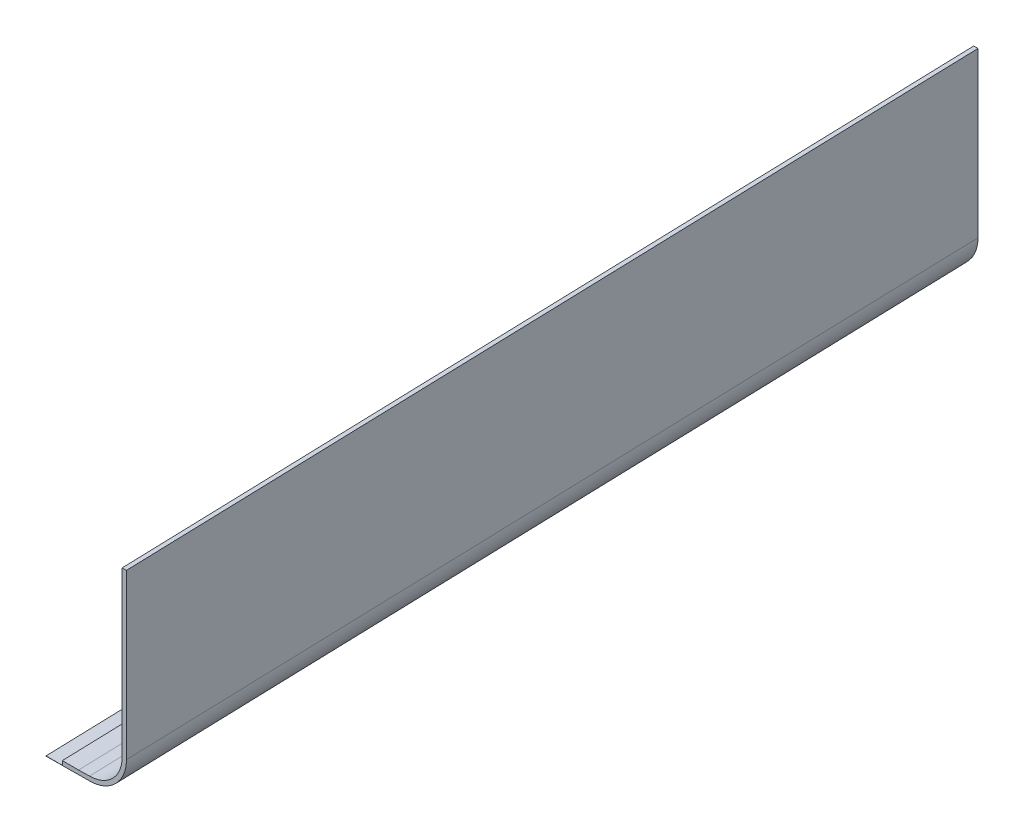
ISO-10303-21;
HEADER;
FILE_DESCRIPTION(('STEP AP214'),'2;1');
FILE_NAME('part.step','',(''),(''),'','','');
FILE_SCHEMA(('AUTOMOTIVE_DESIGN { 1 0 10303 214 1 1 1 1 }'));
ENDSEC;
DATA;
#1=APPLICATION_CONTEXT('core data for automotive mechanical design processes');
#2=APPLICATION_PROTOCOL_DEFINITION('international standard','automotive_design',2000,#1);
#3=PRODUCT_CONTEXT('',#1,'mechanical');
#4=PRODUCT('Part','Part','',(#3));
#5=PRODUCT_RELATED_PRODUCT_CATEGORY('part','',(#4));
#6=PRODUCT_DEFINITION_FORMATION('','',#4);
#7=PRODUCT_DEFINITION_CONTEXT('part definition',#1,'design');
#8=PRODUCT_DEFINITION('design','',#6,#7);
#9=PRODUCT_DEFINITION_SHAPE('','',#8);
#10=(LENGTH_UNIT() NAMED_UNIT(*) SI_UNIT(.MILLI.,.METRE.));
#11=(NAMED_UNIT(*) PLANE_ANGLE_UNIT() SI_UNIT($,.RADIAN.));
#12=(NAMED_UNIT(*) SI_UNIT($,.STERADIAN.) SOLID_ANGLE_UNIT());
#13=UNCERTAINTY_MEASURE_WITH_UNIT(LENGTH_MEASURE(1.E-05),#10,'distance_accuracy_value','');
#14=(GEOMETRIC_REPRESENTATION_CONTEXT(3) GLOBAL_UNCERTAINTY_ASSIGNED_CONTEXT((#13)) GLOBAL_UNIT_ASSIGNED_CONTEXT((#10,
#11,#12)) REPRESENTATION_CONTEXT('',''));
#15=CARTESIAN_POINT('',(0.,0.,0.));
#16=DIRECTION('',(0.,0.,1.));
#17=DIRECTION('',(1.,0.,0.));
#18=AXIS2_PLACEMENT_3D('',#15,#16,#17);
#19=CARTESIAN_POINT('',(-608.850787596417,19.0838018169764,1946.21768543067));
#20=DIRECTION('',(0.,0.,1.));
#21=DIRECTION('',(-1.,0.,0.));
#22=AXIS2_PLACEMENT_3D('',#19,#20,#21);
#23=PLANE('',#22);
#24=DIRECTION('',(-1.,0.,0.));
#25=VECTOR('',#24,1.);
#26=CARTESIAN_POINT('',(434.306263496742,9.50000000004892,1946.21768543067));
#27=LINE('',#26,#25);
#28=CARTESIAN_POINT('',(419.156982691729,9.50000000000034,1946.21768543067));
#29=VERTEX_POINT('',#28);
#30=CARTESIAN_POINT('',(381.05698269362,9.50000000006092,1946.21768543067));
#31=VERTEX_POINT('',#30);
#32=EDGE_CURVE('E51',#29,#31,#27,.T.);
#33=ORIENTED_EDGE('',*,*,#32,.T.);
#34=DIRECTION('',(0.,-1.,0.));
#35=VECTOR('',#34,1.);
#36=CARTESIAN_POINT('',(381.05698269362,9.50000000006085,1946.21768543067));
#37=LINE('',#36,#35);
#38=CARTESIAN_POINT('',(381.05698269362,4.87625381574441E-11,1946.21768543067));
#39=VERTEX_POINT('',#38);
#40=EDGE_CURVE('E133',#31,#39,#37,.T.);
#41=ORIENTED_EDGE('',*,*,#40,.T.);
#42=DIRECTION('',(-1.,0.,0.));
#43=VECTOR('',#42,1.);
#44=CARTESIAN_POINT('',(396.240241590001,4.87732762507734E-11,1946.21768543067));
#45=LINE('',#44,#43);
#46=CARTESIAN_POINT('',(342.939982275244,4.87355805779996E-11,1946.21768543067));
#47=VERTEX_POINT('',#46);
#48=EDGE_CURVE('E131',#39,#47,#45,.T.);
#49=ORIENTED_EDGE('',*,*,#48,.T.);
#50=DIRECTION('',(0.,-1.,0.));
#51=VECTOR('',#50,1.);
#52=CARTESIAN_POINT('',(342.939982275244,-0.55622483418302,1946.21768543067));
#53=LINE('',#52,#51);
#54=CARTESIAN_POINT('',(342.939982275244,-0.556224834243613,1946.21768543067));
#55=VERTEX_POINT('',#54);
#56=EDGE_CURVE('E184',#47,#55,#53,.T.);
#57=ORIENTED_EDGE('',*,*,#56,.T.);
#58=DIRECTION('',(0.999975311121071,0.00702688752706654,0.));
#59=VECTOR('',#58,1.);
#60=CARTESIAN_POINT('',(459.989454906777,0.266288952032419,1946.21768543067));
#61=LINE('',#60,#59);
#62=CARTESIAN_POINT('',(444.863846729292,0.160000380445076,1946.21768543067));
#63=VERTEX_POINT('',#62);
#64=EDGE_CURVE('E187',#55,#63,#61,.T.);
#65=ORIENTED_EDGE('',*,*,#64,.T.);
#66=CARTESIAN_POINT('',(444.863846727584,0.160000380433081,1946.21768543067));
#67=CARTESIAN_POINT('',(446.075132009914,0.16012658548986,1946.21768543067));
#68=CARTESIAN_POINT('',(447.286402545048,0.185942096113205,1946.21768543067));
#69=CARTESIAN_POINT('',(449.706818586305,0.288619720504979,1946.21768543067));
#70=CARTESIAN_POINT('',(450.915964023309,0.365483464888938,1946.21768543067));
#71=CARTESIAN_POINT('',(453.329989040791,0.56992823933107,1946.21768543067));
#72=CARTESIAN_POINT('',(454.534868506007,0.697510629370093,1946.21768543067));
#73=CARTESIAN_POINT('',(456.938224946225,1.00313623517374,1946.21768543067));
#74=CARTESIAN_POINT('',(458.136701852302,1.18117999307029,1946.21768543067));
#75=CARTESIAN_POINT('',(460.524156212143,1.58740577515196,1946.21768543067));
#76=CARTESIAN_POINT('',(461.713140427793,1.81554804394174,1946.21768543067));
#77=CARTESIAN_POINT('',(464.080390498519,2.32178732574375,1946.21768543067));
#78=CARTESIAN_POINT('',(465.258656644489,2.59988297872575,1946.21768543067));
#79=CARTESIAN_POINT('',(467.602400003739,3.20545805432234,1946.21768543067));
#80=CARTESIAN_POINT('',(468.767877588454,3.53293603857233,1946.21768543067));
#81=CARTESIAN_POINT('',(471.083926500928,4.23672634338672,1946.21768543067));
#82=CARTESIAN_POINT('',(472.234498275918,4.6130371950266,1946.21768543067));
#83=CARTESIAN_POINT('',(474.900240682015,5.54773573399297,1946.21768543067));
#84=CARTESIAN_POINT('',(476.408851896602,6.12496039562342,1946.21768543067));
#85=CARTESIAN_POINT('',(479.390936105928,7.36396436911601,1946.21768543067));
#86=CARTESIAN_POINT('',(480.86440810202,8.02574608067341,1946.21768543067));
#87=CARTESIAN_POINT('',(483.771896304211,9.4310315732472,1946.21768543067));
#88=CARTESIAN_POINT('',(485.205911456072,10.1745375351862,1946.21768543067));
#89=CARTESIAN_POINT('',(488.029881223033,11.7403046123265,1946.21768543067));
#90=CARTESIAN_POINT('',(489.419845030492,12.5625491509059,1946.21768543067));
#91=CARTESIAN_POINT('',(492.151792604209,14.2831614117084,1946.21768543067));
#92=CARTESIAN_POINT('',(493.493776854729,15.1815283653138,1946.21768543067));
#93=CARTESIAN_POINT('',(496.125610793553,17.0517182422845,1946.21768543067));
#94=CARTESIAN_POINT('',(497.415460680973,18.0235408850616,1946.21768543067));
#95=CARTESIAN_POINT('',(499.62590899119,19.7881554942323,1946.21768543067));
#96=CARTESIAN_POINT('',(500.558793361587,20.565623716279,1946.21768543067));
#97=CARTESIAN_POINT('',(502.390899150654,22.1594712899273,1946.21768543067));
#98=CARTESIAN_POINT('',(503.290118658197,22.9758528446442,1946.21768543067));
#99=CARTESIAN_POINT('',(504.612139734102,24.2285581215197,1946.21768543067));
#100=CARTESIAN_POINT('',(505.048348507215,24.6508185828612,1946.21768543067));
#101=CARTESIAN_POINT('',(505.91161331581,25.5045937795863,1946.21768543067));
#102=CARTESIAN_POINT('',(506.338669374485,25.9361084915141,1946.21768543067));
#103=CARTESIAN_POINT('',(507.605821365279,27.2441787030871,1946.21768543067));
#104=CARTESIAN_POINT('',(508.431965574148,28.134321366299,1946.21768543067));
#105=CARTESIAN_POINT('',(510.045872379531,29.9490048860587,1946.21768543067));
#106=CARTESIAN_POINT('',(510.833628173081,30.8735517886896,1946.21768543067));
#107=CARTESIAN_POINT('',(512.369397245156,32.7549975247759,1946.21768543067));
#108=CARTESIAN_POINT('',(513.117409617706,33.7118970949167,1946.21768543067));
#109=CARTESIAN_POINT('',(515.300184586929,36.6285965589517,1946.21768543067));
#110=CARTESIAN_POINT('',(516.673985658656,38.6347355647285,1946.21768543067));
#111=CARTESIAN_POINT('',(518.816316133548,42.0628983887761,1946.21768543067));
#112=CARTESIAN_POINT('',(519.633274084055,43.4550700178213,1946.21768543067));
#113=CARTESIAN_POINT('',(521.188256177966,46.2829374148307,1946.21768543067));
#114=CARTESIAN_POINT('',(521.926282726784,47.7186318547354,1946.21768543067));
#115=CARTESIAN_POINT('',(523.320540131027,50.629226047409,1946.21768543067));
#116=CARTESIAN_POINT('',(523.976768720845,52.1041268847277,1946.21768543067));
#117=CARTESIAN_POINT('',(525.204308251733,55.0879387823803,1946.21768543067));
#118=CARTESIAN_POINT('',(525.775664906084,56.5968310263492,1946.21768543067));
#119=CARTESIAN_POINT('',(526.832513288696,59.6443143741614,1946.21768543067));
#120=CARTESIAN_POINT('',(527.318007287181,61.1829046915887,1946.21768543067));
#121=CARTESIAN_POINT('',(528.201751682637,64.2846020300852,1946.21768543067));
#122=CARTESIAN_POINT('',(528.600023433324,65.8477029498336,1946.21768543067));
#123=CARTESIAN_POINT('',(529.187223223895,68.4564629356411,1946.21768543067));
#124=CARTESIAN_POINT('',(529.401197176231,69.4965569678018,1946.21768543067));
#125=CARTESIAN_POINT('',(529.790504211599,71.5837632884045,1946.21768543067));
#126=CARTESIAN_POINT('',(529.965845056845,72.6308741233759,1946.21768543067));
#127=CARTESIAN_POINT('',(530.277836450322,74.730730186376,1946.21768543067));
#128=CARTESIAN_POINT('',(530.414490778553,75.7834748536832,1946.21768543067));
#129=CARTESIAN_POINT('',(530.64882373004,77.8918794467869,1946.21768543067));
#130=CARTESIAN_POINT('',(530.74655387791,78.9475336436468,1946.21768543067));
#131=CARTESIAN_POINT('',(530.90312416498,81.0618246306778,1946.21768543067));
#132=CARTESIAN_POINT('',(530.961960609294,82.1204616946288,1946.21768543067));
#133=CARTESIAN_POINT('',(531.040504224417,84.2393962703731,1946.21768543067));
#134=CARTESIAN_POINT('',(531.06020360615,85.2996940706731,1946.21768543067));
#135=CARTESIAN_POINT('',(531.060210458669,86.3600000000617,1946.21768543067));
#136=B_SPLINE_CURVE_WITH_KNOTS('',3,(#66,#67,#68,#69,#70,#71,#72,#73,#74,#75,#76,#77,#78,#79,
#80,#81,#82,#83,#84,#85,#86,#87,#88,#89,#90,#91,#92,#93,#94,#95,#96,#97,#98,#99,#100,#101,#102,
#103,#104,#105,#106,#107,#108,#109,#110,#111,#112,#113,#114,#115,#116,#117,#118,#119,#120,#121,
#122,#123,#124,#125,#126,#127,#128,#129,#130,#131,#132,#133,#134,#135),.UNSPECIFIED.,.F.,.F.,(4,
2,2,2,2,2,2,2,2,2,2,2,2,2,2,2,2,2,2,2,2,2,2,2,2,2,2,2,2,2,2,2,2,2,4),(0.,3.63356640503929,
7.2672488813773,10.9010287986441,14.5348477569217,18.1657934722738,21.7966403465219,
25.4273814851131,29.0580134339474,33.9011169086868,38.7443578593073,43.5877280897865,
48.4300808908611,53.2723848039148,58.1146702211352,61.7568304011651,65.3991970310311,
67.2204071561581,69.0416126657918,72.6837574812032,76.3265454057439,79.9694163342264,
87.2538044987339,92.0941721614174,96.9343922729995,101.774746417149,106.612483947252,
111.450093547545,116.286517478941,119.471486559318,122.655815126732,125.839832450861,
129.019620915153,132.199711414666,135.380434753818),.UNSPECIFIED.);
#137=CARTESIAN_POINT('',(531.060210458669,86.3600000000617,1946.21768543067));
#138=VERTEX_POINT('',#137);
#139=EDGE_CURVE('E190',#63,#138,#136,.T.);
#140=ORIENTED_EDGE('',*,*,#139,.T.);
#141=DIRECTION('',(0.,1.,0.));
#142=VECTOR('',#141,1.);
#143=CARTESIAN_POINT('',(531.060210458669,86.3600000000737,1946.21768543067));
#144=LINE('',#143,#142);
#145=CARTESIAN_POINT('',(531.060210458669,469.900000000012,1946.21768543067));
#146=VERTEX_POINT('',#145);
#147=EDGE_CURVE('E193',#138,#146,#144,.T.);
#148=ORIENTED_EDGE('',*,*,#147,.T.);
#149=DIRECTION('',(-1.,0.,0.));
#150=VECTOR('',#149,1.);
#151=CARTESIAN_POINT('',(536.114154517747,469.9,1946.21768543067));
#152=LINE('',#151,#150);
#153=CARTESIAN_POINT('',(521.055748406601,469.9,1946.21768543067));
#154=VERTEX_POINT('',#153);
#155=EDGE_CURVE('E196',#146,#154,#152,.T.);
#156=ORIENTED_EDGE('',*,*,#155,.T.);
#157=DIRECTION('',(0.,-1.,0.));
#158=VECTOR('',#157,1.);
#159=CARTESIAN_POINT('',(521.055748406601,86.3600000000737,1946.21768543067));
#160=LINE('',#159,#158);
#161=CARTESIAN_POINT('',(521.055748406601,86.3600000000131,1946.21768543067));
#162=VERTEX_POINT('',#161);
#163=EDGE_CURVE('E169',#154,#162,#160,.T.);
#164=ORIENTED_EDGE('',*,*,#163,.T.);
#165=CARTESIAN_POINT('',(521.055748406601,86.3600000000617,1946.21768543067));
#166=CARTESIAN_POINT('',(521.055762011991,85.3041743859422,1946.21768543067));
#167=CARTESIAN_POINT('',(521.033804668349,84.2483497469097,1946.21768543067));
#168=CARTESIAN_POINT('',(520.946045879157,82.1385269283388,1946.21768543067));
#169=CARTESIAN_POINT('',(520.880244553959,81.0845287437947,1946.21768543067));
#170=CARTESIAN_POINT('',(520.704899262101,78.980221513989,1946.21768543067));
#171=CARTESIAN_POINT('',(520.595357124246,77.9299123163426,1946.21768543067));
#172=CARTESIAN_POINT('',(520.332723814989,75.8347537311795,1946.21768543067));
#173=CARTESIAN_POINT('',(520.179632675189,74.7899043397012,1946.21768543067));
#174=CARTESIAN_POINT('',(519.830167712473,72.7074878920014,1946.21768543067));
#175=CARTESIAN_POINT('',(519.633794648781,71.6699207083693,1946.21768543067));
#176=CARTESIAN_POINT('',(519.198084009917,69.6037485318348,1946.21768543067));
#177=CARTESIAN_POINT('',(518.958742531508,68.5751443620375,1946.21768543067));
#178=CARTESIAN_POINT('',(518.43754719727,66.5288757692183,1946.21768543067));
#179=CARTESIAN_POINT('',(518.155697697832,65.5112102365976,1946.21768543067));
#180=CARTESIAN_POINT('',(517.549927696816,63.4883778286707,1946.21768543067));
#181=CARTESIAN_POINT('',(517.226003373693,62.4832120977868,1946.21768543067));
#182=CARTESIAN_POINT('',(516.536694084313,60.4872995351224,1946.21768543067));
#183=CARTESIAN_POINT('',(516.171312835228,59.4965514195818,1946.21768543067));
#184=CARTESIAN_POINT('',(515.399662567441,57.5310044401117,1946.21768543067));
#185=CARTESIAN_POINT('',(514.9933898351,56.5562070341396,1946.21768543067));
#186=CARTESIAN_POINT('',(514.140720182314,54.6244159190985,1946.21768543067));
#187=CARTESIAN_POINT('',(513.69432655444,53.6674207568317,1946.21768543067));
#188=CARTESIAN_POINT('',(512.76211901337,51.7727234904998,1946.21768543067));
#189=CARTESIAN_POINT('',(512.276301516891,50.8350231498959,1946.21768543067));
#190=CARTESIAN_POINT('',(511.266155255996,48.9806960684853,1946.21768543067));
#191=CARTESIAN_POINT('',(510.741830143782,48.0640673399701,1946.21768543067));
#192=CARTESIAN_POINT('',(509.655533883467,46.2533554666254,1946.21768543067));
#193=CARTESIAN_POINT('',(509.093559261496,45.3592744127448,1946.21768543067));
#194=CARTESIAN_POINT('',(507.35271383301,42.7134071620176,1946.21768543067));
#195=CARTESIAN_POINT('',(506.118652855966,40.9975039342189,1946.21768543067));
#196=CARTESIAN_POINT('',(503.512256394921,37.6741333975381,1946.21768543067));
#197=CARTESIAN_POINT('',(502.139920517038,36.0666663975624,1946.21768543067));
#198=CARTESIAN_POINT('',(499.985207312558,33.7453765906076,1946.21768543067));
#199=CARTESIAN_POINT('',(499.250833229163,32.9865058819205,1946.21768543067));
#200=CARTESIAN_POINT('',(497.7512111848,31.4999577461374,1946.21768543067));
#201=CARTESIAN_POINT('',(496.985966082508,30.7722774436018,1946.21768543067));
#202=CARTESIAN_POINT('',(495.425843649886,29.3492957187999,1946.21768543067));
#203=CARTESIAN_POINT('',(494.630963783755,28.6539970788866,1946.21768543067));
#204=CARTESIAN_POINT('',(493.013067150578,27.297091131196,1946.21768543067));
#205=CARTESIAN_POINT('',(492.190052950058,26.6354807638765,1946.21768543067));
#206=CARTESIAN_POINT('',(490.517156035563,25.3469628688933,1946.21768543067));
#207=CARTESIAN_POINT('',(489.667270492859,24.7200590139988,1946.21768543067));
#208=CARTESIAN_POINT('',(487.942259463241,23.5021668308412,1946.21768543067));
#209=CARTESIAN_POINT('',(487.067136277309,22.9111752435323,1946.21768543067));
#210=CARTESIAN_POINT('',(485.292991088897,21.7660043107471,1946.21768543067));
#211=CARTESIAN_POINT('',(484.393966484036,21.2118289969927,1946.21768543067));
#212=CARTESIAN_POINT('',(482.573746305612,20.1413673843701,1946.21768543067));
#213=CARTESIAN_POINT('',(481.652552754398,19.6250776466787,1946.21768543067));
#214=CARTESIAN_POINT('',(479.78947068903,18.6312040151805,1946.21768543067));
#215=CARTESIAN_POINT('',(478.847581363461,18.1536216424183,1946.21768543067));
#216=CARTESIAN_POINT('',(476.944856558375,17.2380519927266,1946.21768543067));
#217=CARTESIAN_POINT('',(475.984022806229,16.8000611259553,1946.21768543067));
#218=CARTESIAN_POINT('',(474.044989135933,15.9643838980697,1946.21768543067));
#219=CARTESIAN_POINT('',(473.066789290169,15.5666973690016,1946.21768543067));
#220=CARTESIAN_POINT('',(471.094730492017,14.8123211862943,1946.21768543067));
#221=CARTESIAN_POINT('',(470.100871831453,14.4556307696614,1946.21768543067));
#222=CARTESIAN_POINT('',(468.099040599589,13.7838046175111,1946.21768543067));
#223=CARTESIAN_POINT('',(467.091066036365,13.4686748134106,1946.21768543067));
#224=CARTESIAN_POINT('',(465.062850996571,12.8805597794046,1946.21768543067));
#225=CARTESIAN_POINT('',(464.042609641668,12.6075775869795,1946.21768543067));
#226=CARTESIAN_POINT('',(461.534112942367,11.9919745698792,1946.21768543067));
#227=CARTESIAN_POINT('',(460.040083847673,11.6726025832629,1946.21768543067));
#228=CARTESIAN_POINT('',(457.035403536861,11.1241769998362,1946.21768543067));
#229=CARTESIAN_POINT('',(455.524749873552,10.8951368880352,1946.21768543067));
#230=CARTESIAN_POINT('',(452.49031414566,10.5280044862022,1946.21768543067));
#231=CARTESIAN_POINT('',(450.966517546094,10.3900310251121,1946.21768543067));
#232=CARTESIAN_POINT('',(448.67696827238,10.2520297908036,1946.21768543067));
#233=CARTESIAN_POINT('',(447.913148514924,10.2175225391374,1946.21768543067));
#234=CARTESIAN_POINT('',(446.384818043396,10.1715078741109,1946.21768543067));
#235=CARTESIAN_POINT('',(445.620307330716,10.1600004145722,1946.21768543067));
#236=CARTESIAN_POINT('',(444.855748406601,10.1600000000617,1946.21768543067));
#237=B_SPLINE_CURVE_WITH_KNOTS('',3,(#165,#166,#167,#168,#169,#170,#171,#172,#173,#174,#175,
#176,#177,#178,#179,#180,#181,#182,#183,#184,#185,#186,#187,#188,#189,#190,#191,#192,#193,#194,
#195,#196,#197,#198,#199,#200,#201,#202,#203,#204,#205,#206,#207,#208,#209,#210,#211,#212,#213,
#214,#215,#216,#217,#218,#219,#220,#221,#222,#223,#224,#225,#226,#227,#228,#229,#230,#231,#232,
#233,#234,#235,#236),.UNSPECIFIED.,.F.,.F.,(4,2,2,2,2,2,2,2,2,2,2,2,2,2,2,2,2,2,2,2,2,2,2,2,2,2,
2,2,2,2,2,2,2,2,2,4),(0.,3.16724716815026,6.33448564233727,9.5015917081207,12.6686954756207,
15.8357436922488,19.0030797481915,22.1700914233203,25.337390951237,28.5044067122044,
31.6717103517978,34.8387542995656,38.0060864268534,41.1731185398645,44.340443274217,
50.6734138876331,57.0064025412562,60.1737182516054,63.3407413367159,66.5080360440726,
69.6750425852897,72.8423836325301,76.0094368123322,79.1768362439464,82.3439478183834,
85.5111837873487,88.6781322879467,91.8450675908876,95.0119439433013,98.179271775674,
101.346827763547,105.927243837259,110.508343430454,115.095408946864,117.388907384276,
119.682401216876),.UNSPECIFIED.);
#238=CARTESIAN_POINT('',(444.855748406601,10.1600000000617,1946.21768543067));
#239=VERTEX_POINT('',#238);
#240=EDGE_CURVE('E160',#162,#239,#237,.T.);
#241=ORIENTED_EDGE('',*,*,#240,.T.);
#242=DIRECTION('',(-0.99967037619126,-0.0256737018294149,0.));
#243=VECTOR('',#242,1.);
#244=CARTESIAN_POINT('',(459.972140329465,10.5482217061433,1946.21768543067));
#245=LINE('',#244,#243);
#246=EDGE_CURVE('E156',#239,#29,#245,.T.);
#247=ORIENTED_EDGE('',*,*,#246,.T.);
#248=EDGE_LOOP('',(#33,#41,#49,#57,#65,#140,#148,#156,#164,#241,#247));
#249=FACE_BOUND('',#248,.T.);
#250=ADVANCED_FACE('F39',(#249),#23,.T.);
#251=CARTESIAN_POINT('',(444.495580597282,25.4118358930045,-106.238988116982));
#252=DIRECTION('',(0.029863246162196,0.,0.999553993803564));
#253=DIRECTION('',(-0.999553993803564,0.,0.029863246162196));
#254=AXIS2_PLACEMENT_3D('',#251,#252,#253);
#255=PLANE('',#254);
#256=DIRECTION('',(-0.999553993803564,0.,0.0298632461621967));
#257=VECTOR('',#256,1.);
#258=CARTESIAN_POINT('',(357.913898183397,9.50000000000034,-103.652224309232));
#259=LINE('',#258,#257);
#260=CARTESIAN_POINT('',(357.913898183397,9.50000000000034,-103.652224309232));
#261=VERTEX_POINT('',#260);
#262=CARTESIAN_POINT('',(319.847876276655,9.50000000000034,-102.514942091699));
#263=VERTEX_POINT('',#262);
#264=EDGE_CURVE('E140',#261,#263,#259,.T.);
#265=ORIENTED_EDGE('',*,*,#264,.F.);
#266=DIRECTION('',(-0.999224223060489,-0.0256851500128708,0.0298533937430801));
#267=VECTOR('',#266,1.);
#268=CARTESIAN_POINT('',(383.589745390918,10.1600000000132,-104.419330588967));
#269=LINE('',#268,#267);
#270=CARTESIAN_POINT('',(383.589745390918,10.1600000000132,-104.419330588967));
#271=VERTEX_POINT('',#270);
#272=EDGE_CURVE('E152',#271,#261,#269,.T.);
#273=ORIENTED_EDGE('',*,*,#272,.F.);
#274=CARTESIAN_POINT('',(383.589745390918,86.3600000000131,-104.419330588969));
#275=DIRECTION('',(-0.0298632461621969,0.,-0.999553993803564));
#276=DIRECTION('',(7.9305001256913E-13,-1.,0.));
#277=AXIS2_PLACEMENT_3D('',#274,#275,#276);
#278=ELLIPSE('',#277,76.1999999999999,76.1660143278316);
#279=CARTESIAN_POINT('',(459.721789204402,86.3600000000131,-106.693895024034));
#280=VERTEX_POINT('',#279);
#281=EDGE_CURVE('E247',#280,#271,#278,.T.);
#282=ORIENTED_EDGE('',*,*,#281,.F.);
#283=DIRECTION('',(0.,-1.,0.));
#284=VECTOR('',#283,1.);
#285=CARTESIAN_POINT('',(459.721789204402,86.3600000000131,-106.693895024034));
#286=LINE('',#285,#284);
#287=CARTESIAN_POINT('',(459.721789204401,469.899999999952,-106.693895024043));
#288=VERTEX_POINT('',#287);
#289=EDGE_CURVE('E250',#288,#280,#286,.T.);
#290=ORIENTED_EDGE('',*,*,#289,.F.);
#291=DIRECTION('',(-0.999553993803564,0.,0.0298632461621971));
#292=VECTOR('',#291,1.);
#293=CARTESIAN_POINT('',(459.721789204401,469.899999999952,-106.693895024043));
#294=LINE('',#293,#292);
#295=CARTESIAN_POINT('',(469.717329142437,469.899999999952,-106.992527485665));
#296=VERTEX_POINT('',#295);
#297=EDGE_CURVE('E255',#296,#288,#294,.T.);
#298=ORIENTED_EDGE('',*,*,#297,.F.);
#299=DIRECTION('',(0.,1.,0.));
#300=VECTOR('',#299,1.);
#301=CARTESIAN_POINT('',(469.717329142437,86.3600000000131,-106.992527485656));
#302=LINE('',#301,#300);
#303=CARTESIAN_POINT('',(469.717329142437,86.3600000000131,-106.992527485656));
#304=VERTEX_POINT('',#303);
#305=EDGE_CURVE('E258',#304,#296,#302,.T.);
#306=ORIENTED_EDGE('',*,*,#305,.F.);
#307=CARTESIAN_POINT('',(383.59783648971,0.160000380384495,-104.419572323257));
#308=CARTESIAN_POINT('',(389.225791716547,0.160529532905296,-104.587716328854));
#309=CARTESIAN_POINT('',(400.512180038242,1.27377301799808,-104.924914914245));
#310=CARTESIAN_POINT('',(422.18898833738,7.85294079801596,-105.57254362291));
#311=CARTESIAN_POINT('',(446.084319498393,23.8223559634375,-106.286454188035));
#312=CARTESIAN_POINT('',(462.035956153853,47.7391707766942,-106.763034397894));
#313=CARTESIAN_POINT('',(468.606317800006,69.4330674299155,-106.959334276071));
#314=CARTESIAN_POINT('',(469.717329142437,80.7279218520225,-106.992527485656));
#315=CARTESIAN_POINT('',(469.717329142437,86.3600000000131,-106.992527485656));
#316=B_SPLINE_CURVE_WITH_KNOTS('',3,(#307,#308,#309,#310,#311,#312,#313,#314,#315),
.UNSPECIFIED.,.F.,.F.,(4,1,1,1,1,1,4),(9.39383111878794E-05,0.196431736871552,0.392769535431917,
0.785445132552646,1.17812072967338,1.37445852823374,1.5707963267941),.UNSPECIFIED.);
#317=CARTESIAN_POINT('',(383.59783648971,0.160000380384495,-104.419572323257));
#318=VERTEX_POINT('',#317);
#319=EDGE_CURVE('E261',#318,#304,#316,.T.);
#320=ORIENTED_EDGE('',*,*,#319,.F.);
#321=DIRECTION('',(0.999529293909145,0.00703002280594505,-0.0298625082140403));
#322=VECTOR('',#321,1.);
#323=CARTESIAN_POINT('',(383.59783648971,0.160000380384495,-104.419572323257));
#324=LINE('',#323,#322);
#325=CARTESIAN_POINT('',(281.764869112739,-0.556224834243613,-101.377152412919));
#326=VERTEX_POINT('',#325);
#327=EDGE_CURVE('E146',#326,#318,#324,.T.);
#328=ORIENTED_EDGE('',*,*,#327,.F.);
#329=DIRECTION('',(0.,-1.,0.));
#330=VECTOR('',#329,1.);
#331=CARTESIAN_POINT('',(281.764869112739,-0.556224834243613,-101.377152412919));
#332=LINE('',#331,#330);
#333=CARTESIAN_POINT('',(281.764869112739,2.22044604925031E-13,-101.377152412919));
#334=VERTEX_POINT('',#333);
#335=EDGE_CURVE('E144',#334,#326,#332,.T.);
#336=ORIENTED_EDGE('',*,*,#335,.F.);
#337=DIRECTION('',(-0.999553993803564,0.,0.0298632461621968));
#338=VECTOR('',#337,1.);
#339=CARTESIAN_POINT('',(319.847876276655,2.22044604925031E-13,-102.514942091699));
#340=LINE('',#339,#338);
#341=CARTESIAN_POINT('',(319.847876276655,2.22044604925031E-13,-102.514942091699));
#342=VERTEX_POINT('',#341);
#343=EDGE_CURVE('E128',#342,#334,#340,.T.);
#344=ORIENTED_EDGE('',*,*,#343,.F.);
#345=DIRECTION('',(0.,-1.,0.));
#346=VECTOR('',#345,1.);
#347=CARTESIAN_POINT('',(319.847876276655,9.50000000000034,-102.514942091699));
#348=LINE('',#347,#346);
#349=EDGE_CURVE('E135',#263,#342,#348,.T.);
#350=ORIENTED_EDGE('',*,*,#349,.F.);
#351=EDGE_LOOP('',(#265,#273,#282,#290,#298,#306,#320,#328,#336,#344,#350));
#352=FACE_BOUND('',#351,.T.);
#353=ADVANCED_FACE('F142',(#352),#255,.F.);
#354=CARTESIAN_POINT('',(396.24024159,9.50000000006092,2454.41719550408));
#355=DIRECTION('',(-0.999553993803564,0.,0.0298632461621969));
#356=DIRECTION('',(-0.0298632461621969,0.,-0.999553993803565));
#357=AXIS2_PLACEMENT_3D('',#354,#355,#356);
#358=PLANE('',#357);
#359=DIRECTION('',(-0.0298632461621969,0.,-0.999553993803564));
#360=VECTOR('',#359,1.);
#361=CARTESIAN_POINT('',(396.24024159,9.50000000006092,2454.41719550408));
#362=LINE('',#361,#360);
#363=EDGE_CURVE('E11',#31,#263,#362,.T.);
#364=ORIENTED_EDGE('',*,*,#363,.T.);
#365=ORIENTED_EDGE('',*,*,#349,.T.);
#366=DIRECTION('',(-0.0298632461621969,0.,-0.999553993803564));
#367=VECTOR('',#366,1.);
#368=CARTESIAN_POINT('',(396.240241590001,6.08032772518101E-11,2454.41719550408));
#369=LINE('',#368,#367);
#370=EDGE_CURVE('E102',#39,#342,#369,.T.);
#371=ORIENTED_EDGE('',*,*,#370,.F.);
#372=ORIENTED_EDGE('',*,*,#40,.F.);
#373=EDGE_LOOP('',(#364,#365,#371,#372));
#374=FACE_BOUND('',#373,.T.);
#375=ADVANCED_FACE('F136',(#374),#358,.T.);
#376=CARTESIAN_POINT('',(396.240241590001,6.08032772518101E-11,2454.41719550408));
#377=DIRECTION('',(0.,1.,0.));
#378=DIRECTION('',(0.,0.,-1.));
#379=AXIS2_PLACEMENT_3D('',#376,#377,#378);
#380=PLANE('',#379);
#381=ORIENTED_EDGE('',*,*,#370,.T.);
#382=ORIENTED_EDGE('',*,*,#343,.T.);
#383=DIRECTION('',(-0.0298632461621969,0.,-0.999553993803564));
#384=VECTOR('',#383,1.);
#385=CARTESIAN_POINT('',(358.157234426085,6.08032772518101E-11,2455.55498518286));
#386=LINE('',#385,#384);
#387=EDGE_CURVE('E97',#47,#334,#386,.T.);
#388=ORIENTED_EDGE('',*,*,#387,.F.);
#389=ORIENTED_EDGE('',*,*,#48,.F.);
#390=EDGE_LOOP('',(#381,#382,#388,#389));
#391=FACE_BOUND('',#390,.T.);
#392=ADVANCED_FACE('F126',(#391),#380,.T.);
#393=CARTESIAN_POINT('',(358.157234426085,-0.556224834183031,2455.55498518286));
#394=DIRECTION('',(-0.999553993803564,0.,0.0298632461621969));
#395=DIRECTION('',(-0.0298632461621969,0.,-0.999553993803565));
#396=AXIS2_PLACEMENT_3D('',#393,#394,#395);
#397=PLANE('',#396);
#398=ORIENTED_EDGE('',*,*,#387,.T.);
#399=ORIENTED_EDGE('',*,*,#335,.T.);
#400=DIRECTION('',(-0.0298632461621969,0.,-0.999553993803564));
#401=VECTOR('',#400,1.);
#402=CARTESIAN_POINT('',(358.157234426085,-0.556224834183031,2455.55498518286));
#403=LINE('',#402,#401);
#404=EDGE_CURVE('E185',#55,#326,#403,.T.);
#405=ORIENTED_EDGE('',*,*,#404,.F.);
#406=ORIENTED_EDGE('',*,*,#56,.F.);
#407=EDGE_LOOP('',(#398,#399,#405,#406));
#408=FACE_BOUND('',#407,.T.);
#409=ADVANCED_FACE('F224',(#408),#397,.T.);
#410=CARTESIAN_POINT('',(459.990201803055,0.160000380445076,2452.51256527253));
#411=DIRECTION('',(0.00702688737221322,-0.999975289084359,-0.000209939301556124));
#412=DIRECTION('',(0.999975311121071,0.00702688752706654,0.));
#413=AXIS2_PLACEMENT_3D('',#410,#411,#412);
#414=PLANE('',#413);
#415=ORIENTED_EDGE('',*,*,#404,.T.);
#416=ORIENTED_EDGE('',*,*,#327,.T.);
#417=DIRECTION('',(-0.0298632461621969,0.,-0.999553993803564));
#418=VECTOR('',#417,1.);
#419=CARTESIAN_POINT('',(459.990201803055,0.160000380445076,2452.51256527253));
#420=LINE('',#419,#418);
#421=EDGE_CURVE('E188',#63,#318,#420,.T.);
#422=ORIENTED_EDGE('',*,*,#421,.F.);
#423=ORIENTED_EDGE('',*,*,#64,.F.);
#424=EDGE_LOOP('',(#415,#416,#422,#423));
#425=FACE_BOUND('',#424,.T.);
#426=ADVANCED_FACE('F220',(#425),#414,.T.);
#427=CARTESIAN_POINT('',(459.990201803055,0.160000380445076,2452.51256527253));
#428=CARTESIAN_POINT('',(465.618157029893,0.160529532965877,2452.34442126693));
#429=CARTESIAN_POINT('',(476.904545351587,1.27377301805866,2452.00722268154));
#430=CARTESIAN_POINT('',(498.581353650726,7.85294079807654,2451.35959397287));
#431=CARTESIAN_POINT('',(522.476684811738,23.8223559634981,2450.64568340775));
#432=CARTESIAN_POINT('',(538.428321467199,47.7391707767548,2450.16910319789));
#433=CARTESIAN_POINT('',(544.998683113351,69.4330674299761,2449.97280331971));
#434=CARTESIAN_POINT('',(546.109694455782,80.7279218520831,2449.93961011013));
#435=CARTESIAN_POINT('',(546.109694455782,86.3600000000737,2449.93961011013));
#436=B_SPLINE_CURVE_WITH_KNOTS('',3,(#427,#428,#429,#430,#431,#432,#433,#434,#435),
.UNSPECIFIED.,.F.,.F.,(4,1,1,1,1,1,4),(9.39383111878794E-05,0.196431736871552,0.392769535431917,
0.785445132552646,1.17812072967338,1.37445852823374,1.5707963267941),.UNSPECIFIED.);
#437=DIRECTION('',(-0.0298632461621969,0.,-0.999553993803564));
#438=VECTOR('',#437,1.);
#439=SURFACE_OF_LINEAR_EXTRUSION('',#436,#438);
#440=ORIENTED_EDGE('',*,*,#421,.T.);
#441=ORIENTED_EDGE('',*,*,#319,.T.);
#442=DIRECTION('',(-0.0298632461621969,0.,-0.999553993803564));
#443=VECTOR('',#442,1.);
#444=CARTESIAN_POINT('',(546.109694455782,86.3600000000737,2449.93961011013));
#445=LINE('',#444,#443);
#446=EDGE_CURVE('E191',#138,#304,#445,.T.);
#447=ORIENTED_EDGE('',*,*,#446,.F.);
#448=ORIENTED_EDGE('',*,*,#139,.F.);
#449=EDGE_LOOP('',(#440,#441,#447,#448));
#450=FACE_BOUND('',#449,.T.);
#451=ADVANCED_FACE('F214',(#450),#439,.F.);
#452=CARTESIAN_POINT('',(546.109694455782,86.3600000000737,2449.93961011013));
#453=DIRECTION('',(0.999553993803564,0.,-0.0298632461621969));
#454=DIRECTION('',(0.0298632461621969,0.,0.999553993803565));
#455=AXIS2_PLACEMENT_3D('',#452,#453,#454);
#456=PLANE('',#455);
#457=ORIENTED_EDGE('',*,*,#446,.T.);
#458=ORIENTED_EDGE('',*,*,#305,.T.);
#459=DIRECTION('',(-0.0298632461621969,0.,-0.999553993803564));
#460=VECTOR('',#459,1.);
#461=CARTESIAN_POINT('',(546.109694455782,469.900000000012,2449.93961011012));
#462=LINE('',#461,#460);
#463=EDGE_CURVE('E194',#146,#296,#462,.T.);
#464=ORIENTED_EDGE('',*,*,#463,.F.);
#465=ORIENTED_EDGE('',*,*,#147,.F.);
#466=EDGE_LOOP('',(#457,#458,#464,#465));
#467=FACE_BOUND('',#466,.T.);
#468=ADVANCED_FACE('F219',(#467),#456,.T.);
#469=CARTESIAN_POINT('',(536.114154517747,469.900000000012,2450.23824257174));
#470=DIRECTION('',(0.,1.,0.));
#471=DIRECTION('',(0.,0.,-1.));
#472=AXIS2_PLACEMENT_3D('',#469,#470,#471);
#473=PLANE('',#472);
#474=ORIENTED_EDGE('',*,*,#463,.T.);
#475=ORIENTED_EDGE('',*,*,#297,.T.);
#476=DIRECTION('',(-0.0298632461621969,0.,-0.999553993803564));
#477=VECTOR('',#476,1.);
#478=CARTESIAN_POINT('',(536.114154517747,469.900000000012,2450.23824257174));
#479=LINE('',#478,#477);
#480=EDGE_CURVE('E197',#154,#288,#479,.T.);
#481=ORIENTED_EDGE('',*,*,#480,.F.);
#482=ORIENTED_EDGE('',*,*,#155,.F.);
#483=EDGE_LOOP('',(#474,#475,#481,#482));
#484=FACE_BOUND('',#483,.T.);
#485=ADVANCED_FACE('F281',(#484),#473,.T.);
#486=CARTESIAN_POINT('',(536.114154517747,86.3600000000737,2450.23824257175));
#487=DIRECTION('',(-0.999553993803564,0.,0.0298632461621969));
#488=DIRECTION('',(-0.0298632461621969,0.,-0.999553993803565));
#489=AXIS2_PLACEMENT_3D('',#486,#487,#488);
#490=PLANE('',#489);
#491=ORIENTED_EDGE('',*,*,#480,.T.);
#492=ORIENTED_EDGE('',*,*,#289,.T.);
#493=DIRECTION('',(-0.0298632461621969,0.,-0.999553993803564));
#494=VECTOR('',#493,1.);
#495=CARTESIAN_POINT('',(536.114154517747,86.3600000000737,2450.23824257175));
#496=LINE('',#495,#494);
#497=EDGE_CURVE('E168',#162,#280,#496,.T.);
#498=ORIENTED_EDGE('',*,*,#497,.F.);
#499=ORIENTED_EDGE('',*,*,#163,.F.);
#500=EDGE_LOOP('',(#491,#492,#498,#499));
#501=FACE_BOUND('',#500,.T.);
#502=ADVANCED_FACE('F177',(#501),#490,.T.);
#503=CARTESIAN_POINT('',(459.982110704263,86.3600000000737,2452.51280700681));
#504=DIRECTION('',(-0.0298632461621969,0.,-0.999553993803564));
#505=DIRECTION('',(7.9305001256913E-13,-1.,0.));
#506=AXIS2_PLACEMENT_3D('',#503,#504,#505);
#507=ELLIPSE('',#506,76.1999999999999,76.1660143278316);
#508=DIRECTION('',(-0.0298632461621969,0.,-0.999553993803564));
#509=VECTOR('',#508,1.);
#510=SURFACE_OF_LINEAR_EXTRUSION('',#507,#509);
#511=ORIENTED_EDGE('',*,*,#497,.T.);
#512=ORIENTED_EDGE('',*,*,#281,.T.);
#513=DIRECTION('',(-0.0298632461621969,0.,-0.999553993803564));
#514=VECTOR('',#513,1.);
#515=CARTESIAN_POINT('',(459.982110704263,10.1600000000737,2452.51280700682));
#516=LINE('',#515,#514);
#517=EDGE_CURVE('E159',#239,#271,#516,.T.);
#518=ORIENTED_EDGE('',*,*,#517,.F.);
#519=ORIENTED_EDGE('',*,*,#240,.F.);
#520=EDGE_LOOP('',(#511,#512,#518,#519));
#521=FACE_BOUND('',#520,.T.);
#522=ADVANCED_FACE('F171',(#521),#510,.F.);
#523=CARTESIAN_POINT('',(459.982110704263,10.1600000000737,2452.51280700682));
#524=DIRECTION('',(-0.0256736942768094,0.999670082111502,0.00076704195752365));
#525=DIRECTION('',(-0.99967037619126,-0.0256737018294149,0.));
#526=AXIS2_PLACEMENT_3D('',#523,#524,#525);
#527=PLANE('',#526);
#528=ORIENTED_EDGE('',*,*,#517,.T.);
#529=ORIENTED_EDGE('',*,*,#272,.T.);
#530=DIRECTION('',(-0.0298632461621969,0.,-0.999553993803564));
#531=VECTOR('',#530,1.);
#532=CARTESIAN_POINT('',(434.306263496742,9.50000000006092,2453.27991328655));
#533=LINE('',#532,#531);
#534=EDGE_CURVE('E155',#29,#261,#533,.T.);
#535=ORIENTED_EDGE('',*,*,#534,.F.);
#536=ORIENTED_EDGE('',*,*,#246,.F.);
#537=EDGE_LOOP('',(#528,#529,#535,#536));
#538=FACE_BOUND('',#537,.T.);
#539=ADVANCED_FACE('F176',(#538),#527,.T.);
#540=CARTESIAN_POINT('',(434.306263496742,9.50000000006092,2453.27991328655));
#541=DIRECTION('',(0.,1.,0.));
#542=DIRECTION('',(0.,0.,-1.));
#543=AXIS2_PLACEMENT_3D('',#540,#541,#542);
#544=PLANE('',#543);
#545=ORIENTED_EDGE('',*,*,#534,.T.);
#546=ORIENTED_EDGE('',*,*,#264,.T.);
#547=ORIENTED_EDGE('',*,*,#363,.F.);
#548=ORIENTED_EDGE('',*,*,#32,.F.);
#549=EDGE_LOOP('',(#545,#546,#547,#548));
#550=FACE_BOUND('',#549,.T.);
#551=ADVANCED_FACE('F241',(#550),#544,.T.);
#552=CLOSED_SHELL('',(#250,#353,#375,#392,#409,#426,#451,#468,#485,#502,#522,#539,#551));
#553=MANIFOLD_SOLID_BREP('B2',#552);
#554=ADVANCED_BREP_SHAPE_REPRESENTATION('',(#18,#553),#14);
#555=SHAPE_DEFINITION_REPRESENTATION(#9,#554);
ENDSEC;
END-ISO-10303-21;
